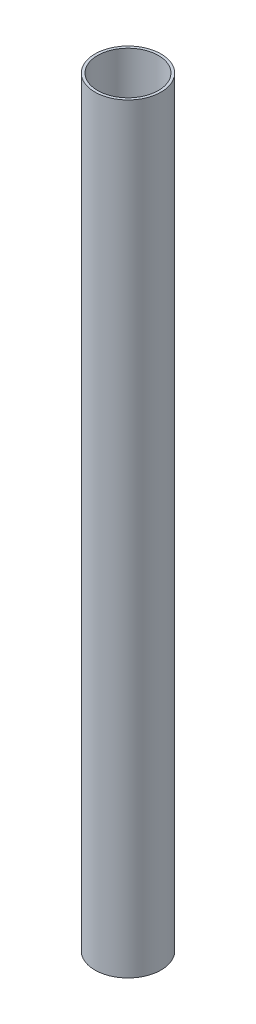
ISO-10303-21;
HEADER;
FILE_DESCRIPTION(('STEP AP214'),'2;1');
FILE_NAME('part.step','',(''),(''),'','','');
FILE_SCHEMA(('AUTOMOTIVE_DESIGN { 1 0 10303 214 1 1 1 1 }'));
ENDSEC;
DATA;
#1=APPLICATION_CONTEXT('core data for automotive mechanical design processes');
#2=APPLICATION_PROTOCOL_DEFINITION('international standard','automotive_design',2000,#1);
#3=PRODUCT_CONTEXT('',#1,'mechanical');
#4=PRODUCT('Part','Part','',(#3));
#5=PRODUCT_RELATED_PRODUCT_CATEGORY('part','',(#4));
#6=PRODUCT_DEFINITION_FORMATION('','',#4);
#7=PRODUCT_DEFINITION_CONTEXT('part definition',#1,'design');
#8=PRODUCT_DEFINITION('design','',#6,#7);
#9=PRODUCT_DEFINITION_SHAPE('','',#8);
#10=(LENGTH_UNIT() NAMED_UNIT(*) SI_UNIT(.MILLI.,.METRE.));
#11=(NAMED_UNIT(*) PLANE_ANGLE_UNIT() SI_UNIT($,.RADIAN.));
#12=(NAMED_UNIT(*) SI_UNIT($,.STERADIAN.) SOLID_ANGLE_UNIT());
#13=UNCERTAINTY_MEASURE_WITH_UNIT(LENGTH_MEASURE(1.E-05),#10,'distance_accuracy_value','');
#14=(GEOMETRIC_REPRESENTATION_CONTEXT(3) GLOBAL_UNCERTAINTY_ASSIGNED_CONTEXT((#13)) GLOBAL_UNIT_ASSIGNED_CONTEXT((#10,
#11,#12)) REPRESENTATION_CONTEXT('',''));
#15=CARTESIAN_POINT('',(0.,0.,0.));
#16=DIRECTION('',(0.,0.,1.));
#17=DIRECTION('',(1.,0.,0.));
#18=AXIS2_PLACEMENT_3D('',#15,#16,#17);
#19=CARTESIAN_POINT('',(0.,287.5,0.));
#20=DIRECTION('',(0.,1.,0.));
#21=DIRECTION('',(0.,0.,1.));
#22=AXIS2_PLACEMENT_3D('',#19,#20,#21);
#23=PLANE('',#22);
#24=CARTESIAN_POINT('',(0.,287.5,0.));
#25=DIRECTION('',(0.,1.,0.));
#26=DIRECTION('',(0.,0.,1.));
#27=AXIS2_PLACEMENT_3D('',#24,#25,#26);
#28=CIRCLE('',#27,12.5);
#29=CARTESIAN_POINT('',(0.,287.5,12.5));
#30=VERTEX_POINT('',#29);
#31=EDGE_CURVE('E10',#30,#30,#28,.T.);
#32=ORIENTED_EDGE('',*,*,#31,.T.);
#33=EDGE_LOOP('',(#32));
#34=FACE_BOUND('',#33,.T.);
#35=CARTESIAN_POINT('',(0.,287.5,0.));
#36=DIRECTION('',(0.,1.,0.));
#37=DIRECTION('',(0.,0.,1.));
#38=AXIS2_PLACEMENT_3D('',#35,#36,#37);
#39=CIRCLE('',#38,11.5);
#40=CARTESIAN_POINT('',(0.,287.5,11.5));
#41=VERTEX_POINT('',#40);
#42=EDGE_CURVE('E44',#41,#41,#39,.T.);
#43=ORIENTED_EDGE('',*,*,#42,.F.);
#44=EDGE_LOOP('',(#43));
#45=FACE_BOUND('',#44,.T.);
#46=ADVANCED_FACE('F33',(#34,#45),#23,.T.);
#47=CARTESIAN_POINT('',(0.,0.,0.));
#48=DIRECTION('',(0.,1.,0.));
#49=DIRECTION('',(0.,0.,1.));
#50=AXIS2_PLACEMENT_3D('',#47,#48,#49);
#51=PLANE('',#50);
#52=CARTESIAN_POINT('',(0.,0.,0.));
#53=DIRECTION('',(0.,1.,0.));
#54=DIRECTION('',(0.,0.,1.));
#55=AXIS2_PLACEMENT_3D('',#52,#53,#54);
#56=CIRCLE('',#55,12.5);
#57=CARTESIAN_POINT('',(0.,0.,12.5));
#58=VERTEX_POINT('',#57);
#59=EDGE_CURVE('E37',#58,#58,#56,.T.);
#60=ORIENTED_EDGE('',*,*,#59,.F.);
#61=EDGE_LOOP('',(#60));
#62=FACE_BOUND('',#61,.T.);
#63=CARTESIAN_POINT('',(0.,0.,0.));
#64=DIRECTION('',(0.,1.,0.));
#65=DIRECTION('',(0.,0.,1.));
#66=AXIS2_PLACEMENT_3D('',#63,#64,#65);
#67=CIRCLE('',#66,11.5);
#68=CARTESIAN_POINT('',(0.,0.,11.5));
#69=VERTEX_POINT('',#68);
#70=EDGE_CURVE('E46',#69,#69,#67,.T.);
#71=ORIENTED_EDGE('',*,*,#70,.T.);
#72=EDGE_LOOP('',(#71));
#73=FACE_BOUND('',#72,.T.);
#74=ADVANCED_FACE('F56',(#62,#73),#51,.F.);
#75=CARTESIAN_POINT('',(0.,287.5,0.));
#76=DIRECTION('',(0.,-1.,0.));
#77=DIRECTION('',(0.,0.,-1.));
#78=AXIS2_PLACEMENT_3D('',#75,#76,#77);
#79=CYLINDRICAL_SURFACE('',#78,12.5);
#80=ORIENTED_EDGE('',*,*,#31,.F.);
#81=EDGE_LOOP('',(#80));
#82=FACE_BOUND('',#81,.T.);
#83=ORIENTED_EDGE('',*,*,#59,.T.);
#84=EDGE_LOOP('',(#83));
#85=FACE_BOUND('',#84,.T.);
#86=ADVANCED_FACE('F35',(#82,#85),#79,.T.);
#87=CARTESIAN_POINT('',(0.,287.5,0.));
#88=DIRECTION('',(0.,-1.,0.));
#89=DIRECTION('',(0.,0.,-1.));
#90=AXIS2_PLACEMENT_3D('',#87,#88,#89);
#91=CYLINDRICAL_SURFACE('',#90,11.5);
#92=ORIENTED_EDGE('',*,*,#42,.T.);
#93=EDGE_LOOP('',(#92));
#94=FACE_BOUND('',#93,.T.);
#95=ORIENTED_EDGE('',*,*,#70,.F.);
#96=EDGE_LOOP('',(#95));
#97=FACE_BOUND('',#96,.T.);
#98=ADVANCED_FACE('F52',(#94,#97),#91,.F.);
#99=CLOSED_SHELL('',(#46,#74,#86,#98));
#100=MANIFOLD_SOLID_BREP('B2',#99);
#101=ADVANCED_BREP_SHAPE_REPRESENTATION('',(#18,#100),#14);
#102=SHAPE_DEFINITION_REPRESENTATION(#9,#101);
ENDSEC;
END-ISO-10303-21;
